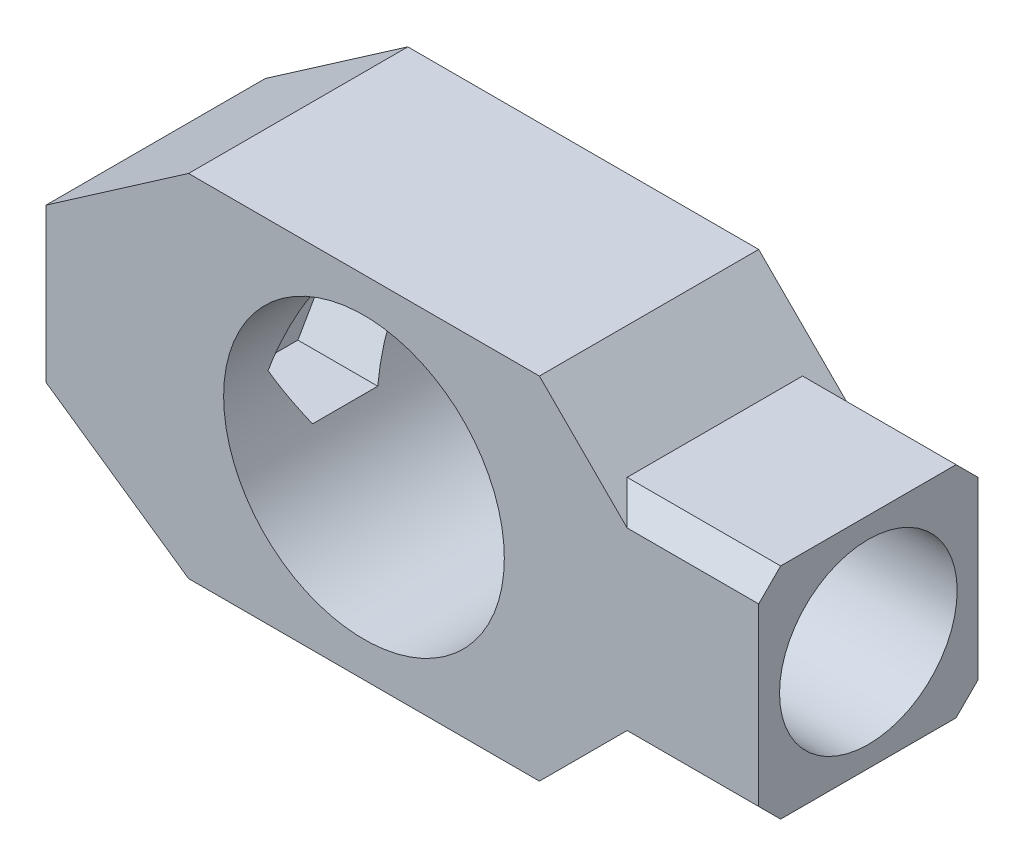
ISO-10303-21;
HEADER;
FILE_DESCRIPTION(('STEP AP214'),'2;1');
FILE_NAME('part.step','',(''),(''),'','','');
FILE_SCHEMA(('AUTOMOTIVE_DESIGN { 1 0 10303 214 1 1 1 1 }'));
ENDSEC;
DATA;
#1=APPLICATION_CONTEXT('core data for automotive mechanical design processes');
#2=APPLICATION_PROTOCOL_DEFINITION('international standard','automotive_design',2000,#1);
#3=PRODUCT_CONTEXT('',#1,'mechanical');
#4=PRODUCT('Part','Part','',(#3));
#5=PRODUCT_RELATED_PRODUCT_CATEGORY('part','',(#4));
#6=PRODUCT_DEFINITION_FORMATION('','',#4);
#7=PRODUCT_DEFINITION_CONTEXT('part definition',#1,'design');
#8=PRODUCT_DEFINITION('design','',#6,#7);
#9=PRODUCT_DEFINITION_SHAPE('','',#8);
#10=(LENGTH_UNIT() NAMED_UNIT(*) SI_UNIT(.MILLI.,.METRE.));
#11=(NAMED_UNIT(*) PLANE_ANGLE_UNIT() SI_UNIT($,.RADIAN.));
#12=(NAMED_UNIT(*) SI_UNIT($,.STERADIAN.) SOLID_ANGLE_UNIT());
#13=UNCERTAINTY_MEASURE_WITH_UNIT(LENGTH_MEASURE(1.E-05),#10,'distance_accuracy_value','');
#14=(GEOMETRIC_REPRESENTATION_CONTEXT(3) GLOBAL_UNCERTAINTY_ASSIGNED_CONTEXT((#13)) GLOBAL_UNIT_ASSIGNED_CONTEXT((#10,
#11,#12)) REPRESENTATION_CONTEXT('',''));
#15=CARTESIAN_POINT('',(0.,0.,0.));
#16=DIRECTION('',(0.,0.,1.));
#17=DIRECTION('',(1.,0.,0.));
#18=AXIS2_PLACEMENT_3D('',#15,#16,#17);
#19=CARTESIAN_POINT('',(0.,0.,20.));
#20=DIRECTION('',(0.,1.,0.));
#21=DIRECTION('',(0.,0.,1.));
#22=AXIS2_PLACEMENT_3D('',#19,#20,#21);
#23=PLANE('',#22);
#24=DIRECTION('',(1.,0.,0.));
#25=VECTOR('',#24,1.);
#26=CARTESIAN_POINT('',(0.,0.,0.));
#27=LINE('',#26,#25);
#28=CARTESIAN_POINT('',(0.,0.,0.));
#29=VERTEX_POINT('',#28);
#30=CARTESIAN_POINT('',(32.,0.,0.));
#31=VERTEX_POINT('',#30);
#32=EDGE_CURVE('E253',#29,#31,#27,.T.);
#33=ORIENTED_EDGE('',*,*,#32,.T.);
#34=DIRECTION('',(0.,0.,-1.));
#35=VECTOR('',#34,1.);
#36=CARTESIAN_POINT('',(32.,0.,20.));
#37=LINE('',#36,#35);
#38=CARTESIAN_POINT('',(32.,0.,20.));
#39=VERTEX_POINT('',#38);
#40=EDGE_CURVE('E267',#39,#31,#37,.T.);
#41=ORIENTED_EDGE('',*,*,#40,.F.);
#42=DIRECTION('',(1.,0.,0.));
#43=VECTOR('',#42,1.);
#44=CARTESIAN_POINT('',(0.,0.,20.));
#45=LINE('',#44,#43);
#46=CARTESIAN_POINT('',(0.,0.,20.));
#47=VERTEX_POINT('',#46);
#48=EDGE_CURVE('E254',#47,#39,#45,.T.);
#49=ORIENTED_EDGE('',*,*,#48,.F.);
#50=DIRECTION('',(0.,0.,-1.));
#51=VECTOR('',#50,1.);
#52=CARTESIAN_POINT('',(0.,0.,20.));
#53=LINE('',#52,#51);
#54=EDGE_CURVE('E270',#47,#29,#53,.T.);
#55=ORIENTED_EDGE('',*,*,#54,.T.);
#56=EDGE_LOOP('',(#33,#41,#49,#55));
#57=FACE_BOUND('',#56,.T.);
#58=ADVANCED_FACE('F33',(#57),#23,.F.);
#59=CARTESIAN_POINT('',(0.,32.,20.));
#60=DIRECTION('',(0.,-1.,0.));
#61=DIRECTION('',(0.,0.,-1.));
#62=AXIS2_PLACEMENT_3D('',#59,#60,#61);
#63=PLANE('',#62);
#64=DIRECTION('',(-1.,0.,0.));
#65=VECTOR('',#64,1.);
#66=CARTESIAN_POINT('',(0.,32.,0.));
#67=LINE('',#66,#65);
#68=CARTESIAN_POINT('',(32.,32.,0.));
#69=VERTEX_POINT('',#68);
#70=CARTESIAN_POINT('',(0.,32.,0.));
#71=VERTEX_POINT('',#70);
#72=EDGE_CURVE('E257',#69,#71,#67,.T.);
#73=ORIENTED_EDGE('',*,*,#72,.T.);
#74=DIRECTION('',(0.,0.,-1.));
#75=VECTOR('',#74,1.);
#76=CARTESIAN_POINT('',(0.,32.,20.));
#77=LINE('',#76,#75);
#78=CARTESIAN_POINT('',(0.,32.,20.));
#79=VERTEX_POINT('',#78);
#80=EDGE_CURVE('E259',#79,#71,#77,.T.);
#81=ORIENTED_EDGE('',*,*,#80,.F.);
#82=DIRECTION('',(-1.,0.,0.));
#83=VECTOR('',#82,1.);
#84=CARTESIAN_POINT('',(0.,32.,20.));
#85=LINE('',#84,#83);
#86=CARTESIAN_POINT('',(32.,32.,20.));
#87=VERTEX_POINT('',#86);
#88=EDGE_CURVE('E256',#87,#79,#85,.T.);
#89=ORIENTED_EDGE('',*,*,#88,.F.);
#90=DIRECTION('',(0.,0.,-1.));
#91=VECTOR('',#90,1.);
#92=CARTESIAN_POINT('',(32.,32.,20.));
#93=LINE('',#92,#91);
#94=EDGE_CURVE('E265',#87,#69,#93,.T.);
#95=ORIENTED_EDGE('',*,*,#94,.T.);
#96=EDGE_LOOP('',(#73,#81,#89,#95));
#97=FACE_BOUND('',#96,.T.);
#98=ADVANCED_FACE('F360',(#97),#63,.F.);
#99=CARTESIAN_POINT('',(0.,0.,20.));
#100=DIRECTION('',(0.,0.,-1.));
#101=DIRECTION('',(-1.,0.,0.));
#102=AXIS2_PLACEMENT_3D('',#99,#100,#101);
#103=PLANE('',#102);
#104=CARTESIAN_POINT('',(16.,16.,20.));
#105=DIRECTION('',(0.,0.,-1.));
#106=DIRECTION('',(-1.,0.,0.));
#107=AXIS2_PLACEMENT_3D('',#104,#105,#106);
#108=CIRCLE('',#107,12.8);
#109=CARTESIAN_POINT('',(3.2,16.,20.));
#110=VERTEX_POINT('',#109);
#111=EDGE_CURVE('E250',#110,#110,#108,.T.);
#112=ORIENTED_EDGE('',*,*,#111,.T.);
#113=EDGE_LOOP('',(#112));
#114=FACE_BOUND('',#113,.T.);
#115=DIRECTION('',(-0.707106781186551,-0.707106781186544,0.));
#116=VECTOR('',#115,1.);
#117=CARTESIAN_POINT('',(15.9999999999998,-16.,20.));
#118=LINE('',#117,#116);
#119=CARTESIAN_POINT('',(40.0000000000001,8.00000000000001,20.));
#120=VERTEX_POINT('',#119);
#121=EDGE_CURVE('E295',#39,#120,#118,.F.);
#122=ORIENTED_EDGE('',*,*,#121,.T.);
#123=DIRECTION('',(1.,0.,0.));
#124=VECTOR('',#123,1.);
#125=CARTESIAN_POINT('',(0.,8.00000000000001,20.));
#126=LINE('',#125,#124);
#127=CARTESIAN_POINT('',(52.,8.00000000000001,20.));
#128=VERTEX_POINT('',#127);
#129=EDGE_CURVE('E322',#120,#128,#126,.T.);
#130=ORIENTED_EDGE('',*,*,#129,.T.);
#131=DIRECTION('',(0.,-1.,0.));
#132=VECTOR('',#131,1.);
#133=CARTESIAN_POINT('',(52.,26.,20.));
#134=LINE('',#133,#132);
#135=CARTESIAN_POINT('',(52.,24.,20.));
#136=VERTEX_POINT('',#135);
#137=EDGE_CURVE('E196',#136,#128,#134,.T.);
#138=ORIENTED_EDGE('',*,*,#137,.F.);
#139=DIRECTION('',(-1.,0.,0.));
#140=VECTOR('',#139,1.);
#141=CARTESIAN_POINT('',(0.,24.,20.));
#142=LINE('',#141,#140);
#143=CARTESIAN_POINT('',(40.0000000000001,24.,20.));
#144=VERTEX_POINT('',#143);
#145=EDGE_CURVE('E319',#136,#144,#142,.T.);
#146=ORIENTED_EDGE('',*,*,#145,.T.);
#147=DIRECTION('',(0.707106781186551,-0.707106781186544,0.));
#148=VECTOR('',#147,1.);
#149=CARTESIAN_POINT('',(31.9999999999998,32.0000000000002,20.));
#150=LINE('',#149,#148);
#151=EDGE_CURVE('E297',#144,#87,#150,.F.);
#152=ORIENTED_EDGE('',*,*,#151,.T.);
#153=ORIENTED_EDGE('',*,*,#88,.T.);
#154=DIRECTION('',(-0.822192191643779,-0.569209978830308,0.));
#155=VECTOR('',#154,1.);
#156=CARTESIAN_POINT('',(0.,32.,20.));
#157=LINE('',#156,#155);
#158=CARTESIAN_POINT('',(-13.,23.,20.));
#159=VERTEX_POINT('',#158);
#160=EDGE_CURVE('E239',#79,#159,#157,.T.);
#161=ORIENTED_EDGE('',*,*,#160,.T.);
#162=DIRECTION('',(0.,-1.,0.));
#163=VECTOR('',#162,1.);
#164=CARTESIAN_POINT('',(-13.,23.,20.));
#165=LINE('',#164,#163);
#166=CARTESIAN_POINT('',(-13.,9.,20.));
#167=VERTEX_POINT('',#166);
#168=EDGE_CURVE('E230',#159,#167,#165,.T.);
#169=ORIENTED_EDGE('',*,*,#168,.T.);
#170=DIRECTION('',(0.822192191643779,-0.569209978830308,0.));
#171=VECTOR('',#170,1.);
#172=CARTESIAN_POINT('',(-13.,9.,20.));
#173=LINE('',#172,#171);
#174=EDGE_CURVE('E225',#167,#47,#173,.T.);
#175=ORIENTED_EDGE('',*,*,#174,.T.);
#176=ORIENTED_EDGE('',*,*,#48,.T.);
#177=EDGE_LOOP('',(#122,#130,#138,#146,#152,#153,#161,#169,#175,#176));
#178=FACE_BOUND('',#177,.T.);
#179=ADVANCED_FACE('F343',(#114,#178),#103,.F.);
#180=CARTESIAN_POINT('',(0.,0.,0.));
#181=DIRECTION('',(0.,0.,-1.));
#182=DIRECTION('',(-1.,0.,0.));
#183=AXIS2_PLACEMENT_3D('',#180,#181,#182);
#184=PLANE('',#183);
#185=CARTESIAN_POINT('',(16.,16.,0.));
#186=DIRECTION('',(0.,0.,1.));
#187=DIRECTION('',(1.,0.,0.));
#188=AXIS2_PLACEMENT_3D('',#185,#186,#187);
#189=CIRCLE('',#188,12.8);
#190=CARTESIAN_POINT('',(28.8,16.,0.));
#191=VERTEX_POINT('',#190);
#192=EDGE_CURVE('E246',#191,#191,#189,.T.);
#193=ORIENTED_EDGE('',*,*,#192,.T.);
#194=EDGE_LOOP('',(#193));
#195=FACE_BOUND('',#194,.T.);
#196=DIRECTION('',(0.,1.,0.));
#197=VECTOR('',#196,1.);
#198=CARTESIAN_POINT('',(52.,6.,0.));
#199=LINE('',#198,#197);
#200=CARTESIAN_POINT('',(52.,8.00000000000001,0.));
#201=VERTEX_POINT('',#200);
#202=CARTESIAN_POINT('',(52.,24.,0.));
#203=VERTEX_POINT('',#202);
#204=EDGE_CURVE('E389',#201,#203,#199,.T.);
#205=ORIENTED_EDGE('',*,*,#204,.F.);
#206=DIRECTION('',(-1.,0.,0.));
#207=VECTOR('',#206,1.);
#208=CARTESIAN_POINT('',(38.,8.00000000000001,0.));
#209=LINE('',#208,#207);
#210=CARTESIAN_POINT('',(40.0000000000001,8.00000000000001,0.));
#211=VERTEX_POINT('',#210);
#212=EDGE_CURVE('E303',#201,#211,#209,.T.);
#213=ORIENTED_EDGE('',*,*,#212,.T.);
#214=DIRECTION('',(0.707106781186551,0.707106781186544,0.));
#215=VECTOR('',#214,1.);
#216=CARTESIAN_POINT('',(38.,6.,0.));
#217=LINE('',#216,#215);
#218=EDGE_CURVE('E293',#211,#31,#217,.F.);
#219=ORIENTED_EDGE('',*,*,#218,.T.);
#220=ORIENTED_EDGE('',*,*,#32,.F.);
#221=DIRECTION('',(0.822192191643779,-0.569209978830308,0.));
#222=VECTOR('',#221,1.);
#223=CARTESIAN_POINT('',(-13.,9.,0.));
#224=LINE('',#223,#222);
#225=CARTESIAN_POINT('',(-13.,9.,0.));
#226=VERTEX_POINT('',#225);
#227=EDGE_CURVE('E226',#226,#29,#224,.T.);
#228=ORIENTED_EDGE('',*,*,#227,.F.);
#229=DIRECTION('',(0.,-1.,0.));
#230=VECTOR('',#229,1.);
#231=CARTESIAN_POINT('',(-13.,23.,0.));
#232=LINE('',#231,#230);
#233=CARTESIAN_POINT('',(-13.,23.,0.));
#234=VERTEX_POINT('',#233);
#235=EDGE_CURVE('E233',#234,#226,#232,.T.);
#236=ORIENTED_EDGE('',*,*,#235,.F.);
#237=DIRECTION('',(-0.822192191643779,-0.569209978830308,0.));
#238=VECTOR('',#237,1.);
#239=CARTESIAN_POINT('',(0.,32.,0.));
#240=LINE('',#239,#238);
#241=EDGE_CURVE('E229',#71,#234,#240,.T.);
#242=ORIENTED_EDGE('',*,*,#241,.F.);
#243=ORIENTED_EDGE('',*,*,#72,.F.);
#244=DIRECTION('',(-0.707106781186551,0.707106781186544,0.));
#245=VECTOR('',#244,1.);
#246=CARTESIAN_POINT('',(38.,26.,0.));
#247=LINE('',#246,#245);
#248=CARTESIAN_POINT('',(40.0000000000001,24.,0.));
#249=VERTEX_POINT('',#248);
#250=EDGE_CURVE('E299',#69,#249,#247,.F.);
#251=ORIENTED_EDGE('',*,*,#250,.T.);
#252=DIRECTION('',(1.,0.,0.));
#253=VECTOR('',#252,1.);
#254=CARTESIAN_POINT('',(52.,24.,0.));
#255=LINE('',#254,#253);
#256=EDGE_CURVE('E301',#249,#203,#255,.T.);
#257=ORIENTED_EDGE('',*,*,#256,.T.);
#258=EDGE_LOOP('',(#205,#213,#219,#220,#228,#236,#242,#243,#251,#257));
#259=FACE_BOUND('',#258,.T.);
#260=ADVANCED_FACE('F367',(#195,#259),#184,.T.);
#261=CARTESIAN_POINT('',(16.,16.,0.));
#262=DIRECTION('',(0.,0.,1.));
#263=DIRECTION('',(1.,0.,0.));
#264=AXIS2_PLACEMENT_3D('',#261,#262,#263);
#265=CYLINDRICAL_SURFACE('',#264,12.8);
#266=CARTESIAN_POINT('',(16.,16.,4.05329222734686));
#267=DIRECTION('',(0.,-0.5,-0.866025403784439));
#268=DIRECTION('',(0.,-0.866025403784439,0.5));
#269=AXIS2_PLACEMENT_3D('',#266,#267,#268);
#270=ELLIPSE('',#269,14.7801668912544,12.8);
#271=CARTESIAN_POINT('',(3.2,16.,4.05329222734686));
#272=VERTEX_POINT('',#271);
#273=CARTESIAN_POINT('',(4.28174501045484,10.85,7.02664611367343));
#274=VERTEX_POINT('',#273);
#275=EDGE_CURVE('E283',#272,#274,#270,.F.);
#276=ORIENTED_EDGE('',*,*,#275,.T.);
#277=DIRECTION('',(0.,0.,1.));
#278=VECTOR('',#277,1.);
#279=CARTESIAN_POINT('',(4.28174501045484,10.85,0.));
#280=LINE('',#279,#278);
#281=CARTESIAN_POINT('',(4.28174501045484,10.85,12.9733538863266));
#282=VERTEX_POINT('',#281);
#283=EDGE_CURVE('E286',#274,#282,#280,.T.);
#284=ORIENTED_EDGE('',*,*,#283,.T.);
#285=CARTESIAN_POINT('',(16.,16.,15.9467077726531));
#286=DIRECTION('',(0.,-0.5,0.866025403784439));
#287=DIRECTION('',(0.,0.866025403784439,0.5));
#288=AXIS2_PLACEMENT_3D('',#285,#286,#287);
#289=ELLIPSE('',#288,14.7801668912544,12.8);
#290=CARTESIAN_POINT('',(3.2,16.,15.9467077726531));
#291=VERTEX_POINT('',#290);
#292=EDGE_CURVE('E175',#282,#291,#289,.F.);
#293=ORIENTED_EDGE('',*,*,#292,.T.);
#294=CARTESIAN_POINT('',(16.,16.,15.9467077726531));
#295=DIRECTION('',(0.,0.499999999999999,0.866025403784439));
#296=DIRECTION('',(0.,-0.866025403784439,0.499999999999999));
#297=AXIS2_PLACEMENT_3D('',#294,#295,#296);
#298=ELLIPSE('',#297,14.7801668912544,12.8);
#299=CARTESIAN_POINT('',(4.28174501045484,21.15,12.9733538863266));
#300=VERTEX_POINT('',#299);
#301=EDGE_CURVE('E274',#291,#300,#298,.F.);
#302=ORIENTED_EDGE('',*,*,#301,.T.);
#303=DIRECTION('',(0.,0.,1.));
#304=VECTOR('',#303,1.);
#305=CARTESIAN_POINT('',(4.28174501045484,21.15,0.));
#306=LINE('',#305,#304);
#307=CARTESIAN_POINT('',(4.28174501045484,21.15,7.02664611367343));
#308=VERTEX_POINT('',#307);
#309=EDGE_CURVE('E277',#300,#308,#306,.F.);
#310=ORIENTED_EDGE('',*,*,#309,.T.);
#311=CARTESIAN_POINT('',(16.,16.,4.05329222734686));
#312=DIRECTION('',(0.,0.5,-0.866025403784438));
#313=DIRECTION('',(0.,0.866025403784439,0.5));
#314=AXIS2_PLACEMENT_3D('',#311,#312,#313);
#315=ELLIPSE('',#314,14.7801668912544,12.8);
#316=EDGE_CURVE('E280',#308,#272,#315,.F.);
#317=ORIENTED_EDGE('',*,*,#316,.T.);
#318=EDGE_LOOP('',(#276,#284,#293,#302,#310,#317));
#319=FACE_BOUND('',#318,.T.);
#320=ORIENTED_EDGE('',*,*,#192,.F.);
#321=EDGE_LOOP('',(#320));
#322=FACE_BOUND('',#321,.T.);
#323=ORIENTED_EDGE('',*,*,#111,.F.);
#324=EDGE_LOOP('',(#323));
#325=FACE_BOUND('',#324,.T.);
#326=ADVANCED_FACE('F510',(#319,#322,#325),#265,.F.);
#327=CARTESIAN_POINT('',(-13.,9.,0.));
#328=DIRECTION('',(-0.569209978830308,-0.822192191643779,0.));
#329=DIRECTION('',(0.822192191643779,-0.569209978830308,0.));
#330=AXIS2_PLACEMENT_3D('',#327,#328,#329);
#331=PLANE('',#330);
#332=ORIENTED_EDGE('',*,*,#174,.F.);
#333=DIRECTION('',(0.,0.,1.));
#334=VECTOR('',#333,1.);
#335=CARTESIAN_POINT('',(-13.,9.,0.));
#336=LINE('',#335,#334);
#337=EDGE_CURVE('E244',#226,#167,#336,.T.);
#338=ORIENTED_EDGE('',*,*,#337,.F.);
#339=ORIENTED_EDGE('',*,*,#227,.T.);
#340=ORIENTED_EDGE('',*,*,#54,.F.);
#341=EDGE_LOOP('',(#332,#338,#339,#340));
#342=FACE_BOUND('',#341,.T.);
#343=ADVANCED_FACE('F380',(#342),#331,.T.);
#344=CARTESIAN_POINT('',(-13.,23.,0.));
#345=DIRECTION('',(-1.,0.,0.));
#346=DIRECTION('',(0.,0.,1.));
#347=AXIS2_PLACEMENT_3D('',#344,#345,#346);
#348=PLANE('',#347);
#349=CARTESIAN_POINT('',(-13.,16.,10.));
#350=DIRECTION('',(-1.,0.,0.));
#351=DIRECTION('',(0.,0.,1.));
#352=AXIS2_PLACEMENT_3D('',#349,#350,#351);
#353=CIRCLE('',#352,3.25);
#354=CARTESIAN_POINT('',(-13.,16.,13.25));
#355=VERTEX_POINT('',#354);
#356=EDGE_CURVE('E222',#355,#355,#353,.T.);
#357=ORIENTED_EDGE('',*,*,#356,.F.);
#358=EDGE_LOOP('',(#357));
#359=FACE_BOUND('',#358,.T.);
#360=ORIENTED_EDGE('',*,*,#168,.F.);
#361=DIRECTION('',(0.,0.,1.));
#362=VECTOR('',#361,1.);
#363=CARTESIAN_POINT('',(-13.,23.,0.));
#364=LINE('',#363,#362);
#365=EDGE_CURVE('E236',#234,#159,#364,.T.);
#366=ORIENTED_EDGE('',*,*,#365,.F.);
#367=ORIENTED_EDGE('',*,*,#235,.T.);
#368=ORIENTED_EDGE('',*,*,#337,.T.);
#369=EDGE_LOOP('',(#360,#366,#367,#368));
#370=FACE_BOUND('',#369,.T.);
#371=ADVANCED_FACE('F375',(#359,#370),#348,.T.);
#372=CARTESIAN_POINT('',(0.,32.,0.));
#373=DIRECTION('',(-0.569209978830308,0.822192191643779,0.));
#374=DIRECTION('',(-0.822192191643779,-0.569209978830308,0.));
#375=AXIS2_PLACEMENT_3D('',#372,#373,#374);
#376=PLANE('',#375);
#377=ORIENTED_EDGE('',*,*,#160,.F.);
#378=ORIENTED_EDGE('',*,*,#80,.T.);
#379=ORIENTED_EDGE('',*,*,#241,.T.);
#380=ORIENTED_EDGE('',*,*,#365,.T.);
#381=EDGE_LOOP('',(#377,#378,#379,#380));
#382=FACE_BOUND('',#381,.T.);
#383=ADVANCED_FACE('F372',(#382),#376,.T.);
#384=CARTESIAN_POINT('',(-3.,16.,10.));
#385=DIRECTION('',(-1.,0.,0.));
#386=DIRECTION('',(0.,0.,1.));
#387=AXIS2_PLACEMENT_3D('',#384,#385,#386);
#388=CYLINDRICAL_SURFACE('',#387,3.25);
#389=CARTESIAN_POINT('',(-3.,16.,10.));
#390=DIRECTION('',(-1.,0.,0.));
#391=DIRECTION('',(0.,0.,1.));
#392=AXIS2_PLACEMENT_3D('',#389,#390,#391);
#393=CIRCLE('',#392,3.25);
#394=CARTESIAN_POINT('',(-3.,16.,13.25));
#395=VERTEX_POINT('',#394);
#396=EDGE_CURVE('E212',#395,#395,#393,.T.);
#397=ORIENTED_EDGE('',*,*,#396,.F.);
#398=EDGE_LOOP('',(#397));
#399=FACE_BOUND('',#398,.T.);
#400=ORIENTED_EDGE('',*,*,#356,.T.);
#401=EDGE_LOOP('',(#400));
#402=FACE_BOUND('',#401,.T.);
#403=ADVANCED_FACE('F598',(#399,#402),#388,.F.);
#404=CARTESIAN_POINT('',(17.,10.85,7.02664611367343));
#405=DIRECTION('',(0.,-1.,0.));
#406=DIRECTION('',(0.,0.,-1.));
#407=AXIS2_PLACEMENT_3D('',#404,#405,#406);
#408=PLANE('',#407);
#409=DIRECTION('',(-1.,0.,0.));
#410=VECTOR('',#409,1.);
#411=CARTESIAN_POINT('',(17.,10.85,7.02664611367343));
#412=LINE('',#411,#410);
#413=CARTESIAN_POINT('',(-3.,10.85,7.02664611367343));
#414=VERTEX_POINT('',#413);
#415=EDGE_CURVE('E195',#274,#414,#412,.T.);
#416=ORIENTED_EDGE('',*,*,#415,.T.);
#417=DIRECTION('',(0.,0.,1.));
#418=VECTOR('',#417,1.);
#419=CARTESIAN_POINT('',(-3.,10.85,7.02664611367343));
#420=LINE('',#419,#418);
#421=CARTESIAN_POINT('',(-3.,10.85,12.9733538863266));
#422=VERTEX_POINT('',#421);
#423=EDGE_CURVE('E187',#414,#422,#420,.T.);
#424=ORIENTED_EDGE('',*,*,#423,.T.);
#425=DIRECTION('',(-1.,0.,0.));
#426=VECTOR('',#425,1.);
#427=CARTESIAN_POINT('',(17.,10.85,12.9733538863266));
#428=LINE('',#427,#426);
#429=EDGE_CURVE('E170',#282,#422,#428,.T.);
#430=ORIENTED_EDGE('',*,*,#429,.F.);
#431=ORIENTED_EDGE('',*,*,#283,.F.);
#432=EDGE_LOOP('',(#416,#424,#430,#431));
#433=FACE_BOUND('',#432,.T.);
#434=ADVANCED_FACE('F193',(#433),#408,.F.);
#435=CARTESIAN_POINT('',(17.,16.,4.05329222734686));
#436=DIRECTION('',(0.,-0.5,-0.866025403784439));
#437=DIRECTION('',(0.,0.866025403784439,-0.5));
#438=AXIS2_PLACEMENT_3D('',#435,#436,#437);
#439=PLANE('',#438);
#440=DIRECTION('',(-1.,0.,0.));
#441=VECTOR('',#440,1.);
#442=CARTESIAN_POINT('',(17.,16.,4.05329222734686));
#443=LINE('',#442,#441);
#444=CARTESIAN_POINT('',(-3.,16.,4.05329222734686));
#445=VERTEX_POINT('',#444);
#446=EDGE_CURVE('E213',#272,#445,#443,.T.);
#447=ORIENTED_EDGE('',*,*,#446,.T.);
#448=DIRECTION('',(0.,-0.866025403784439,0.5));
#449=VECTOR('',#448,1.);
#450=CARTESIAN_POINT('',(-3.,16.,4.05329222734686));
#451=LINE('',#450,#449);
#452=EDGE_CURVE('E180',#445,#414,#451,.T.);
#453=ORIENTED_EDGE('',*,*,#452,.T.);
#454=ORIENTED_EDGE('',*,*,#415,.F.);
#455=ORIENTED_EDGE('',*,*,#275,.F.);
#456=EDGE_LOOP('',(#447,#453,#454,#455));
#457=FACE_BOUND('',#456,.T.);
#458=ADVANCED_FACE('F579',(#457),#439,.F.);
#459=CARTESIAN_POINT('',(17.,21.15,7.02664611367343));
#460=DIRECTION('',(0.,0.5,-0.866025403784438));
#461=DIRECTION('',(0.,0.866025403784439,0.5));
#462=AXIS2_PLACEMENT_3D('',#459,#460,#461);
#463=PLANE('',#462);
#464=DIRECTION('',(-1.,0.,0.));
#465=VECTOR('',#464,1.);
#466=CARTESIAN_POINT('',(17.,21.15,7.02664611367343));
#467=LINE('',#466,#465);
#468=CARTESIAN_POINT('',(-3.,21.15,7.02664611367343));
#469=VERTEX_POINT('',#468);
#470=EDGE_CURVE('E215',#308,#469,#467,.T.);
#471=ORIENTED_EDGE('',*,*,#470,.T.);
#472=DIRECTION('',(0.,-0.866025403784438,-0.5));
#473=VECTOR('',#472,1.);
#474=CARTESIAN_POINT('',(-3.,21.15,7.02664611367343));
#475=LINE('',#474,#473);
#476=EDGE_CURVE('E207',#469,#445,#475,.T.);
#477=ORIENTED_EDGE('',*,*,#476,.T.);
#478=ORIENTED_EDGE('',*,*,#446,.F.);
#479=ORIENTED_EDGE('',*,*,#316,.F.);
#480=EDGE_LOOP('',(#471,#477,#478,#479));
#481=FACE_BOUND('',#480,.T.);
#482=ADVANCED_FACE('F569',(#481),#463,.F.);
#483=CARTESIAN_POINT('',(17.,21.15,12.9733538863266));
#484=DIRECTION('',(0.,1.,0.));
#485=DIRECTION('',(0.,0.,1.));
#486=AXIS2_PLACEMENT_3D('',#483,#484,#485);
#487=PLANE('',#486);
#488=DIRECTION('',(-1.,0.,0.));
#489=VECTOR('',#488,1.);
#490=CARTESIAN_POINT('',(17.,21.15,12.9733538863266));
#491=LINE('',#490,#489);
#492=CARTESIAN_POINT('',(-3.,21.15,12.9733538863266));
#493=VERTEX_POINT('',#492);
#494=EDGE_CURVE('E217',#300,#493,#491,.T.);
#495=ORIENTED_EDGE('',*,*,#494,.T.);
#496=DIRECTION('',(0.,0.,-1.));
#497=VECTOR('',#496,1.);
#498=CARTESIAN_POINT('',(-3.,21.15,12.9733538863266));
#499=LINE('',#498,#497);
#500=EDGE_CURVE('E204',#493,#469,#499,.T.);
#501=ORIENTED_EDGE('',*,*,#500,.T.);
#502=ORIENTED_EDGE('',*,*,#470,.F.);
#503=ORIENTED_EDGE('',*,*,#309,.F.);
#504=EDGE_LOOP('',(#495,#501,#502,#503));
#505=FACE_BOUND('',#504,.T.);
#506=ADVANCED_FACE('F559',(#505),#487,.F.);
#507=CARTESIAN_POINT('',(17.,16.,15.9467077726531));
#508=DIRECTION('',(0.,0.499999999999999,0.866025403784439));
#509=DIRECTION('',(0.,-0.866025403784439,0.499999999999999));
#510=AXIS2_PLACEMENT_3D('',#507,#508,#509);
#511=PLANE('',#510);
#512=DIRECTION('',(-1.,0.,0.));
#513=VECTOR('',#512,1.);
#514=CARTESIAN_POINT('',(17.,16.,15.9467077726531));
#515=LINE('',#514,#513);
#516=CARTESIAN_POINT('',(-3.,16.,15.9467077726531));
#517=VERTEX_POINT('',#516);
#518=EDGE_CURVE('E179',#291,#517,#515,.T.);
#519=ORIENTED_EDGE('',*,*,#518,.T.);
#520=DIRECTION('',(0.,0.866025403784439,-0.499999999999999));
#521=VECTOR('',#520,1.);
#522=CARTESIAN_POINT('',(-3.,16.,15.9467077726531));
#523=LINE('',#522,#521);
#524=EDGE_CURVE('E191',#517,#493,#523,.T.);
#525=ORIENTED_EDGE('',*,*,#524,.T.);
#526=ORIENTED_EDGE('',*,*,#494,.F.);
#527=ORIENTED_EDGE('',*,*,#301,.F.);
#528=EDGE_LOOP('',(#519,#525,#526,#527));
#529=FACE_BOUND('',#528,.T.);
#530=ADVANCED_FACE('F550',(#529),#511,.F.);
#531=CARTESIAN_POINT('',(17.,10.85,12.9733538863266));
#532=DIRECTION('',(0.,-0.5,0.866025403784439));
#533=DIRECTION('',(0.,-0.866025403784439,-0.5));
#534=AXIS2_PLACEMENT_3D('',#531,#532,#533);
#535=PLANE('',#534);
#536=ORIENTED_EDGE('',*,*,#429,.T.);
#537=DIRECTION('',(0.,0.866025403784439,0.5));
#538=VECTOR('',#537,1.);
#539=CARTESIAN_POINT('',(-3.,10.85,12.9733538863266));
#540=LINE('',#539,#538);
#541=EDGE_CURVE('E173',#422,#517,#540,.T.);
#542=ORIENTED_EDGE('',*,*,#541,.T.);
#543=ORIENTED_EDGE('',*,*,#518,.F.);
#544=ORIENTED_EDGE('',*,*,#292,.F.);
#545=EDGE_LOOP('',(#536,#542,#543,#544));
#546=FACE_BOUND('',#545,.T.);
#547=ADVANCED_FACE('F172',(#546),#535,.F.);
#548=CARTESIAN_POINT('',(-3.,0.,0.));
#549=DIRECTION('',(-1.,0.,0.));
#550=DIRECTION('',(0.,0.,1.));
#551=AXIS2_PLACEMENT_3D('',#548,#549,#550);
#552=PLANE('',#551);
#553=ORIENTED_EDGE('',*,*,#396,.T.);
#554=EDGE_LOOP('',(#553));
#555=FACE_BOUND('',#554,.T.);
#556=ORIENTED_EDGE('',*,*,#423,.F.);
#557=ORIENTED_EDGE('',*,*,#452,.F.);
#558=ORIENTED_EDGE('',*,*,#476,.F.);
#559=ORIENTED_EDGE('',*,*,#500,.F.);
#560=ORIENTED_EDGE('',*,*,#524,.F.);
#561=ORIENTED_EDGE('',*,*,#541,.F.);
#562=EDGE_LOOP('',(#556,#557,#558,#559,#560,#561));
#563=FACE_BOUND('',#562,.T.);
#564=ADVANCED_FACE('F185',(#555,#563),#552,.F.);
#565=CARTESIAN_POINT('',(52.,0.,0.));
#566=DIRECTION('',(1.,0.,0.));
#567=DIRECTION('',(0.,0.,-1.));
#568=AXIS2_PLACEMENT_3D('',#565,#566,#567);
#569=PLANE('',#568);
#570=DIRECTION('',(0.,0.,-1.));
#571=VECTOR('',#570,1.);
#572=CARTESIAN_POINT('',(52.,6.,0.));
#573=LINE('',#572,#571);
#574=CARTESIAN_POINT('',(52.,6.,18.));
#575=VERTEX_POINT('',#574);
#576=CARTESIAN_POINT('',(52.,6.,2.00000000000002));
#577=VERTEX_POINT('',#576);
#578=EDGE_CURVE('E391',#575,#577,#573,.T.);
#579=ORIENTED_EDGE('',*,*,#578,.T.);
#580=DIRECTION('',(0.,0.707106781186546,-0.707106781186549));
#581=VECTOR('',#580,1.);
#582=CARTESIAN_POINT('',(52.,4.00000000000002,4.));
#583=LINE('',#582,#581);
#584=EDGE_CURVE('E317',#577,#201,#583,.T.);
#585=ORIENTED_EDGE('',*,*,#584,.T.);
#586=ORIENTED_EDGE('',*,*,#204,.T.);
#587=DIRECTION('',(0.,0.707106781186549,0.707106781186546));
#588=VECTOR('',#587,1.);
#589=CARTESIAN_POINT('',(52.,12.,-12.));
#590=LINE('',#589,#588);
#591=CARTESIAN_POINT('',(52.,26.,2.00000000000001));
#592=VERTEX_POINT('',#591);
#593=EDGE_CURVE('E311',#203,#592,#590,.T.);
#594=ORIENTED_EDGE('',*,*,#593,.T.);
#595=DIRECTION('',(0.,0.,1.));
#596=VECTOR('',#595,1.);
#597=CARTESIAN_POINT('',(52.,26.,0.));
#598=LINE('',#597,#596);
#599=CARTESIAN_POINT('',(52.,26.,18.));
#600=VERTEX_POINT('',#599);
#601=EDGE_CURVE('E199',#592,#600,#598,.T.);
#602=ORIENTED_EDGE('',*,*,#601,.T.);
#603=DIRECTION('',(0.,0.707106781186545,-0.70710678118655));
#604=VECTOR('',#603,1.);
#605=CARTESIAN_POINT('',(52.,22.0000000000001,21.9999999999999));
#606=LINE('',#605,#604);
#607=EDGE_CURVE('E313',#600,#136,#606,.F.);
#608=ORIENTED_EDGE('',*,*,#607,.T.);
#609=ORIENTED_EDGE('',*,*,#137,.T.);
#610=DIRECTION('',(0.,0.70710678118655,0.707106781186545));
#611=VECTOR('',#610,1.);
#612=CARTESIAN_POINT('',(52.,-6.00000000000002,6.00000000000006));
#613=LINE('',#612,#611);
#614=EDGE_CURVE('E315',#128,#575,#613,.F.);
#615=ORIENTED_EDGE('',*,*,#614,.T.);
#616=EDGE_LOOP('',(#579,#585,#586,#594,#602,#608,#609,#615));
#617=FACE_BOUND('',#616,.T.);
#618=CARTESIAN_POINT('',(52.,16.,10.));
#619=DIRECTION('',(1.,0.,0.));
#620=DIRECTION('',(0.,0.,-1.));
#621=AXIS2_PLACEMENT_3D('',#618,#619,#620);
#622=CIRCLE('',#621,8.1);
#623=CARTESIAN_POINT('',(52.,16.,1.9));
#624=VERTEX_POINT('',#623);
#625=EDGE_CURVE('E393',#624,#624,#622,.T.);
#626=ORIENTED_EDGE('',*,*,#625,.F.);
#627=EDGE_LOOP('',(#626));
#628=FACE_BOUND('',#627,.T.);
#629=ADVANCED_FACE('F347',(#617,#628),#569,.T.);
#630=CARTESIAN_POINT('',(52.,6.,0.));
#631=DIRECTION('',(0.,1.,0.));
#632=DIRECTION('',(0.,0.,1.));
#633=AXIS2_PLACEMENT_3D('',#630,#631,#632);
#634=PLANE('',#633);
#635=DIRECTION('',(0.,0.,-1.));
#636=VECTOR('',#635,1.);
#637=CARTESIAN_POINT('',(38.,6.,0.));
#638=LINE('',#637,#636);
#639=CARTESIAN_POINT('',(38.,6.,18.));
#640=VERTEX_POINT('',#639);
#641=CARTESIAN_POINT('',(38.,6.,2.00000000000002));
#642=VERTEX_POINT('',#641);
#643=EDGE_CURVE('E288',#640,#642,#638,.T.);
#644=ORIENTED_EDGE('',*,*,#643,.T.);
#645=DIRECTION('',(1.,0.,0.));
#646=VECTOR('',#645,1.);
#647=CARTESIAN_POINT('',(52.,6.,2.00000000000002));
#648=LINE('',#647,#646);
#649=EDGE_CURVE('E309',#642,#577,#648,.T.);
#650=ORIENTED_EDGE('',*,*,#649,.T.);
#651=ORIENTED_EDGE('',*,*,#578,.F.);
#652=DIRECTION('',(-1.,0.,0.));
#653=VECTOR('',#652,1.);
#654=CARTESIAN_POINT('',(52.,6.,18.));
#655=LINE('',#654,#653);
#656=EDGE_CURVE('E306',#575,#640,#655,.T.);
#657=ORIENTED_EDGE('',*,*,#656,.T.);
#658=EDGE_LOOP('',(#644,#650,#651,#657));
#659=FACE_BOUND('',#658,.T.);
#660=ADVANCED_FACE('F414',(#659),#634,.F.);
#661=CARTESIAN_POINT('',(52.,26.,0.));
#662=DIRECTION('',(0.,-1.,0.));
#663=DIRECTION('',(0.,0.,-1.));
#664=AXIS2_PLACEMENT_3D('',#661,#662,#663);
#665=PLANE('',#664);
#666=DIRECTION('',(0.,0.,1.));
#667=VECTOR('',#666,1.);
#668=CARTESIAN_POINT('',(38.,26.,20.));
#669=LINE('',#668,#667);
#670=CARTESIAN_POINT('',(38.,26.,2.00000000000001));
#671=VERTEX_POINT('',#670);
#672=CARTESIAN_POINT('',(38.,26.,18.));
#673=VERTEX_POINT('',#672);
#674=EDGE_CURVE('E291',#671,#673,#669,.T.);
#675=ORIENTED_EDGE('',*,*,#674,.T.);
#676=DIRECTION('',(1.,0.,0.));
#677=VECTOR('',#676,1.);
#678=CARTESIAN_POINT('',(52.,26.,18.));
#679=LINE('',#678,#677);
#680=EDGE_CURVE('E326',#673,#600,#679,.T.);
#681=ORIENTED_EDGE('',*,*,#680,.T.);
#682=ORIENTED_EDGE('',*,*,#601,.F.);
#683=DIRECTION('',(-1.,0.,0.));
#684=VECTOR('',#683,1.);
#685=CARTESIAN_POINT('',(38.,26.,2.00000000000001));
#686=LINE('',#685,#684);
#687=EDGE_CURVE('E324',#592,#671,#686,.T.);
#688=ORIENTED_EDGE('',*,*,#687,.T.);
#689=EDGE_LOOP('',(#675,#681,#682,#688));
#690=FACE_BOUND('',#689,.T.);
#691=ADVANCED_FACE('F406',(#690),#665,.F.);
#692=CARTESIAN_POINT('',(52.,16.,10.));
#693=DIRECTION('',(-1.,0.,0.));
#694=DIRECTION('',(0.,0.,1.));
#695=AXIS2_PLACEMENT_3D('',#692,#693,#694);
#696=CYLINDRICAL_SURFACE('',#695,8.1);
#697=ORIENTED_EDGE('',*,*,#625,.T.);
#698=EDGE_LOOP('',(#697));
#699=FACE_BOUND('',#698,.T.);
#700=CARTESIAN_POINT('',(30.,16.,10.));
#701=DIRECTION('',(1.,0.,0.));
#702=DIRECTION('',(0.,0.,-1.));
#703=AXIS2_PLACEMENT_3D('',#700,#701,#702);
#704=CIRCLE('',#703,8.1);
#705=CARTESIAN_POINT('',(30.,16.,1.9));
#706=VERTEX_POINT('',#705);
#707=EDGE_CURVE('E398',#706,#706,#704,.T.);
#708=ORIENTED_EDGE('',*,*,#707,.F.);
#709=EDGE_LOOP('',(#708));
#710=FACE_BOUND('',#709,.T.);
#711=ADVANCED_FACE('F404',(#699,#710),#696,.F.);
#712=CARTESIAN_POINT('',(38.,6.,0.));
#713=DIRECTION('',(0.707106781186544,-0.707106781186551,0.));
#714=DIRECTION('',(0.,0.,1.));
#715=AXIS2_PLACEMENT_3D('',#712,#713,#714);
#716=PLANE('',#715);
#717=ORIENTED_EDGE('',*,*,#121,.F.);
#718=ORIENTED_EDGE('',*,*,#40,.T.);
#719=ORIENTED_EDGE('',*,*,#218,.F.);
#720=DIRECTION('',(0.577350269189629,0.577350269189623,-0.577350269189625));
#721=VECTOR('',#720,1.);
#722=CARTESIAN_POINT('',(38.6666666666667,6.66666666666667,1.33333333333335));
#723=LINE('',#722,#721);
#724=EDGE_CURVE('E328',#211,#642,#723,.F.);
#725=ORIENTED_EDGE('',*,*,#724,.T.);
#726=ORIENTED_EDGE('',*,*,#643,.F.);
#727=DIRECTION('',(0.577350269189631,0.577350269189625,0.577350269189621));
#728=VECTOR('',#727,1.);
#729=CARTESIAN_POINT('',(32.,0.,12.0000000000001));
#730=LINE('',#729,#728);
#731=EDGE_CURVE('E330',#640,#120,#730,.T.);
#732=ORIENTED_EDGE('',*,*,#731,.T.);
#733=EDGE_LOOP('',(#717,#718,#719,#725,#726,#732));
#734=FACE_BOUND('',#733,.T.);
#735=ADVANCED_FACE('F336',(#734),#716,.T.);
#736=CARTESIAN_POINT('',(38.,26.,0.));
#737=DIRECTION('',(0.707106781186544,0.707106781186551,0.));
#738=DIRECTION('',(0.,0.,-1.));
#739=AXIS2_PLACEMENT_3D('',#736,#737,#738);
#740=PLANE('',#739);
#741=ORIENTED_EDGE('',*,*,#250,.F.);
#742=ORIENTED_EDGE('',*,*,#94,.F.);
#743=ORIENTED_EDGE('',*,*,#151,.F.);
#744=DIRECTION('',(-0.577350269189629,0.577350269189622,-0.577350269189626));
#745=VECTOR('',#744,1.);
#746=CARTESIAN_POINT('',(32.,32.,12.));
#747=LINE('',#746,#745);
#748=EDGE_CURVE('E41',#144,#673,#747,.T.);
#749=ORIENTED_EDGE('',*,*,#748,.T.);
#750=ORIENTED_EDGE('',*,*,#674,.F.);
#751=DIRECTION('',(-0.577350269189631,0.577350269189624,0.577350269189622));
#752=VECTOR('',#751,1.);
#753=CARTESIAN_POINT('',(38.6666666666667,25.3333333333333,1.33333333333335));
#754=LINE('',#753,#752);
#755=EDGE_CURVE('E11',#671,#249,#754,.F.);
#756=ORIENTED_EDGE('',*,*,#755,.T.);
#757=EDGE_LOOP('',(#741,#742,#743,#749,#750,#756));
#758=FACE_BOUND('',#757,.T.);
#759=ADVANCED_FACE('F364',(#758),#740,.T.);
#760=CARTESIAN_POINT('',(0.,8.00000000000001,0.));
#761=DIRECTION('',(0.,-0.707106781186549,-0.707106781186546));
#762=DIRECTION('',(1.,0.,0.));
#763=AXIS2_PLACEMENT_3D('',#760,#761,#762);
#764=PLANE('',#763);
#765=ORIENTED_EDGE('',*,*,#584,.F.);
#766=ORIENTED_EDGE('',*,*,#649,.F.);
#767=ORIENTED_EDGE('',*,*,#724,.F.);
#768=ORIENTED_EDGE('',*,*,#212,.F.);
#769=EDGE_LOOP('',(#765,#766,#767,#768));
#770=FACE_BOUND('',#769,.T.);
#771=ADVANCED_FACE('F388',(#770),#764,.T.);
#772=CARTESIAN_POINT('',(52.,6.,18.));
#773=DIRECTION('',(0.,0.707106781186545,-0.70710678118655));
#774=DIRECTION('',(-1.,0.,0.));
#775=AXIS2_PLACEMENT_3D('',#772,#773,#774);
#776=PLANE('',#775);
#777=ORIENTED_EDGE('',*,*,#614,.F.);
#778=ORIENTED_EDGE('',*,*,#129,.F.);
#779=ORIENTED_EDGE('',*,*,#731,.F.);
#780=ORIENTED_EDGE('',*,*,#656,.F.);
#781=EDGE_LOOP('',(#777,#778,#779,#780));
#782=FACE_BOUND('',#781,.T.);
#783=ADVANCED_FACE('F340',(#782),#776,.F.);
#784=CARTESIAN_POINT('',(0.,24.,20.));
#785=DIRECTION('',(0.,-0.70710678118655,-0.707106781186545));
#786=DIRECTION('',(-1.,0.,0.));
#787=AXIS2_PLACEMENT_3D('',#784,#785,#786);
#788=PLANE('',#787);
#789=ORIENTED_EDGE('',*,*,#607,.F.);
#790=ORIENTED_EDGE('',*,*,#680,.F.);
#791=ORIENTED_EDGE('',*,*,#748,.F.);
#792=ORIENTED_EDGE('',*,*,#145,.F.);
#793=EDGE_LOOP('',(#789,#790,#791,#792));
#794=FACE_BOUND('',#793,.T.);
#795=ADVANCED_FACE('F355',(#794),#788,.F.);
#796=CARTESIAN_POINT('',(52.,26.,2.00000000000001));
#797=DIRECTION('',(0.,0.707106781186546,-0.707106781186549));
#798=DIRECTION('',(1.,0.,0.));
#799=AXIS2_PLACEMENT_3D('',#796,#797,#798);
#800=PLANE('',#799);
#801=ORIENTED_EDGE('',*,*,#593,.F.);
#802=ORIENTED_EDGE('',*,*,#256,.F.);
#803=ORIENTED_EDGE('',*,*,#755,.F.);
#804=ORIENTED_EDGE('',*,*,#687,.F.);
#805=EDGE_LOOP('',(#801,#802,#803,#804));
#806=FACE_BOUND('',#805,.T.);
#807=ADVANCED_FACE('F35',(#806),#800,.T.);
#808=CARTESIAN_POINT('',(30.,16.,10.));
#809=DIRECTION('',(1.,0.,0.));
#810=DIRECTION('',(0.,0.,-1.));
#811=AXIS2_PLACEMENT_3D('',#808,#809,#810);
#812=PLANE('',#811);
#813=ORIENTED_EDGE('',*,*,#707,.T.);
#814=EDGE_LOOP('',(#813));
#815=FACE_BOUND('',#814,.T.);
#816=ADVANCED_FACE('F402',(#815),#812,.T.);
#817=CLOSED_SHELL('',(#58,#98,#179,#260,#326,#343,#371,#383,#403,#434,#458,#482,#506,#530,#547,
#564,#629,#660,#691,#711,#735,#759,#771,#783,#795,#807,#816));
#818=MANIFOLD_SOLID_BREP('B2',#817);
#819=ADVANCED_BREP_SHAPE_REPRESENTATION('',(#18,#818),#14);
#820=SHAPE_DEFINITION_REPRESENTATION(#9,#819);
ENDSEC;
END-ISO-10303-21;
